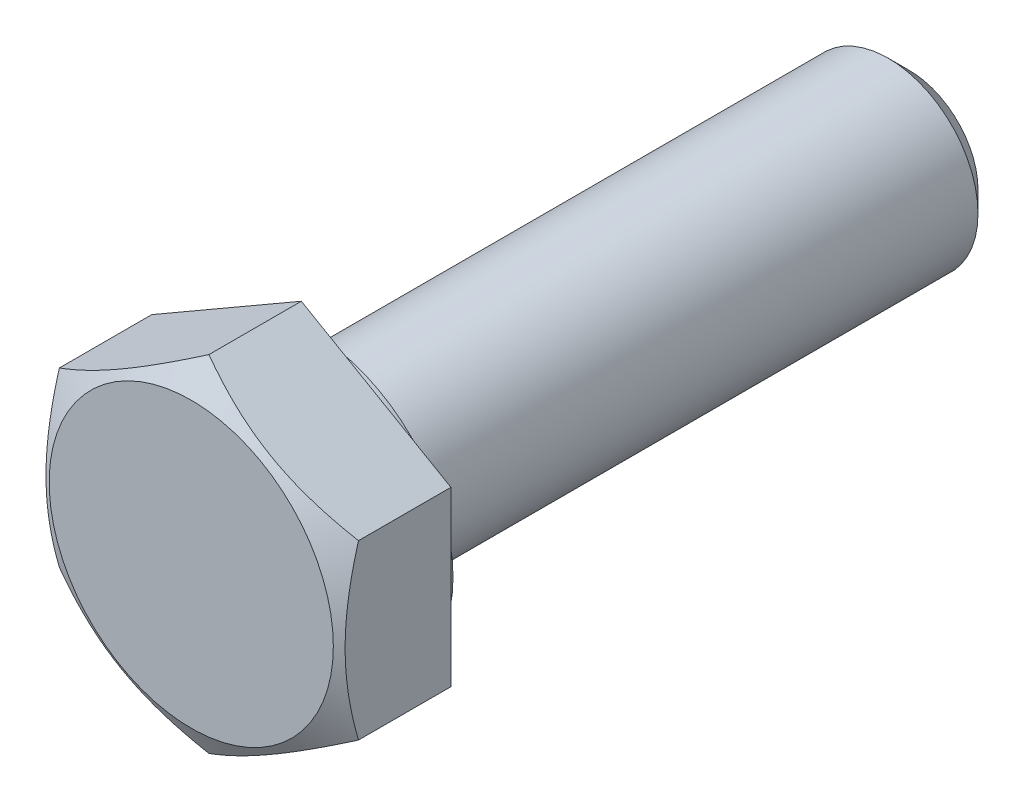
ISO-10303-21;
HEADER;
FILE_DESCRIPTION(('STEP AP214'),'2;1');
FILE_NAME('part.step','',(''),(''),'','','');
FILE_SCHEMA(('AUTOMOTIVE_DESIGN { 1 0 10303 214 1 1 1 1 }'));
ENDSEC;
DATA;
#1=APPLICATION_CONTEXT('core data for automotive mechanical design processes');
#2=APPLICATION_PROTOCOL_DEFINITION('international standard','automotive_design',2000,#1);
#3=PRODUCT_CONTEXT('',#1,'mechanical');
#4=PRODUCT('Part','Part','',(#3));
#5=PRODUCT_RELATED_PRODUCT_CATEGORY('part','',(#4));
#6=PRODUCT_DEFINITION_FORMATION('','',#4);
#7=PRODUCT_DEFINITION_CONTEXT('part definition',#1,'design');
#8=PRODUCT_DEFINITION('design','',#6,#7);
#9=PRODUCT_DEFINITION_SHAPE('','',#8);
#10=(LENGTH_UNIT() NAMED_UNIT(*) SI_UNIT(.MILLI.,.METRE.));
#11=(NAMED_UNIT(*) PLANE_ANGLE_UNIT() SI_UNIT($,.RADIAN.));
#12=(NAMED_UNIT(*) SI_UNIT($,.STERADIAN.) SOLID_ANGLE_UNIT());
#13=UNCERTAINTY_MEASURE_WITH_UNIT(LENGTH_MEASURE(1.E-05),#10,'distance_accuracy_value','');
#14=(GEOMETRIC_REPRESENTATION_CONTEXT(3) GLOBAL_UNCERTAINTY_ASSIGNED_CONTEXT((#13)) GLOBAL_UNIT_ASSIGNED_CONTEXT((#10,
#11,#12)) REPRESENTATION_CONTEXT('',''));
#15=CARTESIAN_POINT('',(0.,0.,0.));
#16=DIRECTION('',(0.,0.,1.));
#17=DIRECTION('',(1.,0.,0.));
#18=AXIS2_PLACEMENT_3D('',#15,#16,#17);
#19=CARTESIAN_POINT('',(0.,5.77350269189626,8.32));
#20=DIRECTION('',(0.,0.,1.));
#21=DIRECTION('',(1.,0.,0.));
#22=AXIS2_PLACEMENT_3D('',#19,#20,#21);
#23=PLANE('',#22);
#24=CARTESIAN_POINT('',(0.,0.,8.32));
#25=DIRECTION('',(0.,0.,1.));
#26=DIRECTION('',(1.,0.,0.));
#27=AXIS2_PLACEMENT_3D('',#24,#25,#26);
#28=CIRCLE('',#27,4.75);
#29=CARTESIAN_POINT('',(4.75,0.,8.32));
#30=VERTEX_POINT('',#29);
#31=EDGE_CURVE('E186',#30,#30,#28,.T.);
#32=ORIENTED_EDGE('',*,*,#31,.T.);
#33=EDGE_LOOP('',(#32));
#34=FACE_BOUND('',#33,.T.);
#35=DIRECTION('',(0.,1.,0.));
#36=VECTOR('',#35,1.);
#37=CARTESIAN_POINT('',(5.,5.77350269189626,8.32));
#38=LINE('',#37,#36);
#39=CARTESIAN_POINT('',(5.,-2.88675134594813,8.32));
#40=VERTEX_POINT('',#39);
#41=CARTESIAN_POINT('',(5.,2.88675134594813,8.32));
#42=VERTEX_POINT('',#41);
#43=EDGE_CURVE('E12',#40,#42,#38,.T.);
#44=ORIENTED_EDGE('',*,*,#43,.F.);
#45=DIRECTION('',(0.866025403784439,0.5,0.));
#46=VECTOR('',#45,1.);
#47=CARTESIAN_POINT('',(5.,-2.88675134594813,8.32));
#48=LINE('',#47,#46);
#49=CARTESIAN_POINT('',(0.,-5.77350269189626,8.32));
#50=VERTEX_POINT('',#49);
#51=EDGE_CURVE('E46',#50,#40,#48,.T.);
#52=ORIENTED_EDGE('',*,*,#51,.F.);
#53=DIRECTION('',(0.866025403784439,-0.5,0.));
#54=VECTOR('',#53,1.);
#55=CARTESIAN_POINT('',(-5.,-2.88675134594813,8.32));
#56=LINE('',#55,#54);
#57=CARTESIAN_POINT('',(-5.,-2.88675134594813,8.32));
#58=VERTEX_POINT('',#57);
#59=EDGE_CURVE('E108',#58,#50,#56,.T.);
#60=ORIENTED_EDGE('',*,*,#59,.F.);
#61=DIRECTION('',(0.,-1.,0.));
#62=VECTOR('',#61,1.);
#63=CARTESIAN_POINT('',(-5.,5.77350269189626,8.32));
#64=LINE('',#63,#62);
#65=CARTESIAN_POINT('',(-5.,2.88675134594813,8.32));
#66=VERTEX_POINT('',#65);
#67=EDGE_CURVE('E106',#66,#58,#64,.T.);
#68=ORIENTED_EDGE('',*,*,#67,.F.);
#69=DIRECTION('',(-0.866025403784439,-0.5,0.));
#70=VECTOR('',#69,1.);
#71=CARTESIAN_POINT('',(0.,5.77350269189626,8.32));
#72=LINE('',#71,#70);
#73=CARTESIAN_POINT('',(0.,5.77350269189626,8.32));
#74=VERTEX_POINT('',#73);
#75=EDGE_CURVE('E92',#74,#66,#72,.T.);
#76=ORIENTED_EDGE('',*,*,#75,.F.);
#77=DIRECTION('',(-0.866025403784439,0.5,0.));
#78=VECTOR('',#77,1.);
#79=CARTESIAN_POINT('',(0.,5.77350269189626,8.32));
#80=LINE('',#79,#78);
#81=EDGE_CURVE('E87',#42,#74,#80,.T.);
#82=ORIENTED_EDGE('',*,*,#81,.F.);
#83=EDGE_LOOP('',(#44,#52,#60,#68,#76,#82));
#84=FACE_BOUND('',#83,.T.);
#85=ADVANCED_FACE('F38',(#34,#84),#23,.F.);
#86=CARTESIAN_POINT('',(0.,0.,12.));
#87=DIRECTION('',(0.,0.,1.));
#88=DIRECTION('',(1.,0.,0.));
#89=AXIS2_PLACEMENT_3D('',#86,#87,#88);
#90=CYLINDRICAL_SURFACE('',#89,4.75);
#91=ORIENTED_EDGE('',*,*,#31,.F.);
#92=EDGE_LOOP('',(#91));
#93=FACE_BOUND('',#92,.T.);
#94=CARTESIAN_POINT('',(0.,0.,8.));
#95=DIRECTION('',(0.,0.,1.));
#96=DIRECTION('',(1.,0.,0.));
#97=AXIS2_PLACEMENT_3D('',#94,#95,#96);
#98=CIRCLE('',#97,4.75);
#99=CARTESIAN_POINT('',(4.75,0.,8.));
#100=VERTEX_POINT('',#99);
#101=EDGE_CURVE('E183',#100,#100,#98,.T.);
#102=ORIENTED_EDGE('',*,*,#101,.T.);
#103=EDGE_LOOP('',(#102));
#104=FACE_BOUND('',#103,.T.);
#105=ADVANCED_FACE('F221',(#93,#104),#90,.T.);
#106=CARTESIAN_POINT('',(0.,4.75,8.));
#107=DIRECTION('',(0.,0.,1.));
#108=DIRECTION('',(1.,0.,0.));
#109=AXIS2_PLACEMENT_3D('',#106,#107,#108);
#110=PLANE('',#109);
#111=ORIENTED_EDGE('',*,*,#101,.F.);
#112=EDGE_LOOP('',(#111));
#113=FACE_BOUND('',#112,.T.);
#114=CARTESIAN_POINT('',(0.,0.,8.));
#115=DIRECTION('',(0.,0.,1.));
#116=DIRECTION('',(1.,0.,0.));
#117=AXIS2_PLACEMENT_3D('',#114,#115,#116);
#118=CIRCLE('',#117,3.);
#119=CARTESIAN_POINT('',(3.,0.,8.));
#120=VERTEX_POINT('',#119);
#121=EDGE_CURVE('E180',#120,#120,#118,.T.);
#122=ORIENTED_EDGE('',*,*,#121,.T.);
#123=EDGE_LOOP('',(#122));
#124=FACE_BOUND('',#123,.T.);
#125=ADVANCED_FACE('F226',(#113,#124),#110,.F.);
#126=CARTESIAN_POINT('',(0.,0.,12.));
#127=DIRECTION('',(0.,0.,1.));
#128=DIRECTION('',(1.,0.,0.));
#129=AXIS2_PLACEMENT_3D('',#126,#127,#128);
#130=CYLINDRICAL_SURFACE('',#129,3.);
#131=ORIENTED_EDGE('',*,*,#121,.F.);
#132=EDGE_LOOP('',(#131));
#133=FACE_BOUND('',#132,.T.);
#134=CARTESIAN_POINT('',(0.,0.,-11.3));
#135=DIRECTION('',(0.,0.,1.));
#136=DIRECTION('',(1.,0.,0.));
#137=AXIS2_PLACEMENT_3D('',#134,#135,#136);
#138=CIRCLE('',#137,3.);
#139=CARTESIAN_POINT('',(3.,0.,-11.3));
#140=VERTEX_POINT('',#139);
#141=EDGE_CURVE('E177',#140,#140,#138,.T.);
#142=ORIENTED_EDGE('',*,*,#141,.T.);
#143=EDGE_LOOP('',(#142));
#144=FACE_BOUND('',#143,.T.);
#145=ADVANCED_FACE('F232',(#133,#144),#130,.T.);
#146=CARTESIAN_POINT('',(0.,0.,-12.));
#147=DIRECTION('',(0.,0.,1.));
#148=DIRECTION('',(1.,0.,0.));
#149=AXIS2_PLACEMENT_3D('',#146,#147,#148);
#150=CONICAL_SURFACE('',#149,2.29999999999999,0.78539816339745);
#151=ORIENTED_EDGE('',*,*,#141,.F.);
#152=EDGE_LOOP('',(#151));
#153=FACE_BOUND('',#152,.T.);
#154=CARTESIAN_POINT('',(0.,0.,-12.));
#155=DIRECTION('',(0.,0.,1.));
#156=DIRECTION('',(1.,0.,0.));
#157=AXIS2_PLACEMENT_3D('',#154,#155,#156);
#158=CIRCLE('',#157,2.29999999999999);
#159=CARTESIAN_POINT('',(2.29999999999999,0.,-12.));
#160=VERTEX_POINT('',#159);
#161=EDGE_CURVE('E167',#160,#160,#158,.T.);
#162=ORIENTED_EDGE('',*,*,#161,.T.);
#163=EDGE_LOOP('',(#162));
#164=FACE_BOUND('',#163,.T.);
#165=ADVANCED_FACE('F235',(#153,#164),#150,.T.);
#166=CARTESIAN_POINT('',(0.,2.29999999999999,-12.));
#167=DIRECTION('',(0.,0.,1.));
#168=DIRECTION('',(1.,0.,0.));
#169=AXIS2_PLACEMENT_3D('',#166,#167,#168);
#170=PLANE('',#169);
#171=ORIENTED_EDGE('',*,*,#161,.F.);
#172=EDGE_LOOP('',(#171));
#173=FACE_BOUND('',#172,.T.);
#174=ADVANCED_FACE('F158',(#173),#170,.F.);
#175=CARTESIAN_POINT('',(5.,-2.88675134594813,-12.));
#176=DIRECTION('',(1.,0.,0.));
#177=DIRECTION('',(0.,1.,0.));
#178=AXIS2_PLACEMENT_3D('',#175,#176,#177);
#179=PLANE('',#178);
#180=CARTESIAN_POINT('',(5.,-7.63608831020962,9.47269384044658));
#181=CARTESIAN_POINT('',(5.,-7.41671502063001,9.57862390183092));
#182=CARTESIAN_POINT('',(5.,-7.19682078948626,9.68349478183039));
#183=CARTESIAN_POINT('',(5.,-6.75570867749105,9.89051245252426));
#184=CARTESIAN_POINT('',(5.,-6.53449057337866,9.99265876692992));
#185=CARTESIAN_POINT('',(5.,-6.08924401850543,10.1941640760569));
#186=CARTESIAN_POINT('',(5.,-5.86520671689426,10.2935035850024));
#187=CARTESIAN_POINT('',(5.,-5.41528330479419,10.4878868135465));
#188=CARTESIAN_POINT('',(5.,-5.18939729207492,10.5829307586056));
#189=CARTESIAN_POINT('',(5.,-4.73270635601579,10.7686699506858));
#190=CARTESIAN_POINT('',(5.,-4.5018748681938,10.8593002418616));
#191=CARTESIAN_POINT('',(5.,-4.03748213336677,11.0334125903535));
#192=CARTESIAN_POINT('',(5.,-3.80392058531511,11.1168938507237));
#193=CARTESIAN_POINT('',(5.,-3.33418257692391,11.2744503927579));
#194=CARTESIAN_POINT('',(5.,-3.09801295329933,11.3485458479584));
#195=CARTESIAN_POINT('',(5.,-2.622317210366,11.4849114956443));
#196=CARTESIAN_POINT('',(5.,-2.38279218329777,11.5471854444038));
#197=CARTESIAN_POINT('',(5.,-1.90021405498409,11.6568740474413));
#198=CARTESIAN_POINT('',(5.,-1.65715979122221,11.7042836837094));
#199=CARTESIAN_POINT('',(5.,-1.16814339899781,11.7810345020717));
#200=CARTESIAN_POINT('',(5.,-0.922181264261045,11.8103756451725));
#201=CARTESIAN_POINT('',(5.,-0.430179275668583,11.8483933297189));
#202=CARTESIAN_POINT('',(5.,-0.18414962738837,11.8571985975323));
#203=CARTESIAN_POINT('',(5.,0.307704322292009,11.8536856005624));
#204=CARTESIAN_POINT('',(5.,0.553528660038113,11.8413727165713));
#205=CARTESIAN_POINT('',(5.,0.973839544225612,11.8031276828399));
#206=CARTESIAN_POINT('',(5.,1.14879180614304,11.7820465400916));
#207=CARTESIAN_POINT('',(5.,1.49733080573963,11.7305685605382));
#208=CARTESIAN_POINT('',(5.,1.67091733426056,11.700170324272));
#209=CARTESIAN_POINT('',(5.,2.18990458001968,11.5965135855341));
#210=CARTESIAN_POINT('',(5.,2.53285316893865,11.510862772391));
#211=CARTESIAN_POINT('',(5.,3.04581132525505,11.3633458062989));
#212=CARTESIAN_POINT('',(5.,3.21850342236316,11.3102849605877));
#213=CARTESIAN_POINT('',(5.,3.56221900439277,11.1989136733608));
#214=CARTESIAN_POINT('',(5.,3.73324233808919,11.1406027608866));
#215=CARTESIAN_POINT('',(5.,4.07276682817564,11.0199778737321));
#216=CARTESIAN_POINT('',(5.,4.24127677843429,10.9576884020102));
#217=CARTESIAN_POINT('',(5.,4.57686542207983,10.82952844901));
#218=CARTESIAN_POINT('',(5.,4.74394458950532,10.7636592114534));
#219=CARTESIAN_POINT('',(5.,4.91042173992309,10.6963357738042));
#220=B_SPLINE_CURVE_WITH_KNOTS('',3,(#180,#181,#182,#183,#184,#185,#186,#187,#188,#189,#190,
#191,#192,#193,#194,#195,#196,#197,#198,#199,#200,#201,#202,#203,#204,#205,#206,#207,#208,#209,
#210,#211,#212,#213,#214,#215,#216,#217,#218,#219),.UNSPECIFIED.,.F.,.F.,(4,2,2,2,2,2,2,2,2,2,2,
2,2,2,2,2,2,2,2,4),(0.,0.730839835481473,1.46180660468968,2.19699145656864,2.93213767603387,
3.67600400363847,4.4199531468705,5.16227511291297,5.90436081048045,6.64669675802213,
7.38903430757832,8.12670595994832,8.86418968544289,9.39258492676547,9.92105957388045,
10.9800497280791,11.5219872993396,12.0639735337611,12.602894729619,13.1416298698482),.UNSPECIFIED.);
#221=CARTESIAN_POINT('',(5.,2.88675134594813,11.4090804453174));
#222=VERTEX_POINT('',#221);
#223=CARTESIAN_POINT('',(5.,-2.88675134594813,11.4090804453174));
#224=VERTEX_POINT('',#223);
#225=EDGE_CURVE('E125',#222,#224,#220,.F.);
#226=ORIENTED_EDGE('',*,*,#225,.T.);
#227=DIRECTION('',(0.,0.,1.));
#228=VECTOR('',#227,1.);
#229=CARTESIAN_POINT('',(5.,-2.88675134594813,-12.));
#230=LINE('',#229,#228);
#231=EDGE_CURVE('E118',#40,#224,#230,.T.);
#232=ORIENTED_EDGE('',*,*,#231,.F.);
#233=ORIENTED_EDGE('',*,*,#43,.T.);
#234=DIRECTION('',(0.,0.,1.));
#235=VECTOR('',#234,1.);
#236=CARTESIAN_POINT('',(5.,2.88675134594813,-12.));
#237=LINE('',#236,#235);
#238=EDGE_CURVE('E58',#42,#222,#237,.T.);
#239=ORIENTED_EDGE('',*,*,#238,.T.);
#240=EDGE_LOOP('',(#226,#232,#233,#239));
#241=FACE_BOUND('',#240,.T.);
#242=ADVANCED_FACE('F123',(#241),#179,.T.);
#243=CARTESIAN_POINT('',(0.,-5.77350269189626,-12.));
#244=DIRECTION('',(0.5,-0.866025403784439,0.));
#245=DIRECTION('',(0.866025403784439,0.5,0.));
#246=AXIS2_PLACEMENT_3D('',#243,#244,#245);
#247=PLANE('',#246);
#248=CARTESIAN_POINT('',(5.0002,-2.88663587589429,11.4090137766508));
#249=CARTESIAN_POINT('',(4.78046540547481,-3.01349970319368,11.482275865065));
#250=CARTESIAN_POINT('',(4.55885141554042,-3.14144859993849,11.5489111107845));
#251=CARTESIAN_POINT('',(4.11178600454649,-3.39956193532121,11.6652234416918));
#252=CARTESIAN_POINT('',(3.88632664040923,-3.52973095989718,11.7148593827868));
#253=CARTESIAN_POINT('',(3.43816769477649,-3.78847564779798,11.7921114072839));
#254=CARTESIAN_POINT('',(3.21553790689581,-3.91701101576052,11.8202420544191));
#255=CARTESIAN_POINT('',(2.88081009815336,-4.11026620624323,11.8454675107489));
#256=CARTESIAN_POINT('',(2.76915780319494,-4.17472868879311,11.8510489729331));
#257=CARTESIAN_POINT('',(2.5457500293262,-4.30371322717528,11.8564602159511));
#258=CARTESIAN_POINT('',(2.43399455370969,-4.36823528110589,11.8562901744444));
#259=CARTESIAN_POINT('',(2.12781576914936,-4.54500768479194,11.8479088009106));
#260=CARTESIAN_POINT('',(1.93349391403279,-4.65719946015293,11.8338326608053));
#261=CARTESIAN_POINT('',(1.54613989800229,-4.88083840557981,11.7891971755932));
#262=CARTESIAN_POINT('',(1.35310909862843,-4.9922847895602,11.7586225725551));
#263=CARTESIAN_POINT('',(0.964974657525146,-5.21637431361295,11.6821939390814));
#264=CARTESIAN_POINT('',(0.769920001358265,-5.32898917185759,11.6360160538239));
#265=CARTESIAN_POINT('',(0.382719654641232,-5.55253939626498,11.5312106382107));
#266=CARTESIAN_POINT('',(0.190569004591913,-5.66347762579592,11.4726077292652));
#267=CARTESIAN_POINT('',(-0.000200000000000036,-5.7736181619501,11.4090137766508));
#268=B_SPLINE_CURVE_WITH_KNOTS('',3,(#248,#249,#250,#251,#252,#253,#254,#255,#256,#257,#258,
#259,#260,#261,#262,#263,#264,#265,#266,#267),.UNSPECIFIED.,.F.,.F.,(4,2,2,2,2,2,2,2,2,4),(0.,
0.792555841363089,1.58701660053333,2.3618153748728,2.74884076077325,3.13585419177295,
3.80962362599679,4.48401723901189,5.17336882348928,5.86136694793725),.UNSPECIFIED.);
#269=CARTESIAN_POINT('',(0.,-5.77350269189626,11.4090804453174));
#270=VERTEX_POINT('',#269);
#271=EDGE_CURVE('E168',#224,#270,#268,.T.);
#272=ORIENTED_EDGE('',*,*,#271,.T.);
#273=DIRECTION('',(0.,0.,1.));
#274=VECTOR('',#273,1.);
#275=CARTESIAN_POINT('',(0.,-5.77350269189626,-12.));
#276=LINE('',#275,#274);
#277=EDGE_CURVE('E121',#50,#270,#276,.T.);
#278=ORIENTED_EDGE('',*,*,#277,.F.);
#279=ORIENTED_EDGE('',*,*,#51,.T.);
#280=ORIENTED_EDGE('',*,*,#231,.T.);
#281=EDGE_LOOP('',(#272,#278,#279,#280));
#282=FACE_BOUND('',#281,.T.);
#283=ADVANCED_FACE('F117',(#282),#247,.T.);
#284=CARTESIAN_POINT('',(-5.,-2.88675134594813,-12.));
#285=DIRECTION('',(-0.5,-0.866025403784439,0.));
#286=DIRECTION('',(0.866025403784439,-0.5,0.));
#287=AXIS2_PLACEMENT_3D('',#284,#285,#286);
#288=PLANE('',#287);
#289=CARTESIAN_POINT('',(0.000199999999999797,-5.7736181619501,11.4090137766508));
#290=CARTESIAN_POINT('',(-0.219534594525185,-5.64675433465071,11.482275865065));
#291=CARTESIAN_POINT('',(-0.441148584459581,-5.5188054379059,11.5489111107845));
#292=CARTESIAN_POINT('',(-0.888213995453513,-5.26069210252318,11.6652234416918));
#293=CARTESIAN_POINT('',(-1.11367335959077,-5.13052307794721,11.7148593827868));
#294=CARTESIAN_POINT('',(-1.56183230522351,-4.87177839004641,11.7921114072839));
#295=CARTESIAN_POINT('',(-1.78446209310419,-4.74324302208387,11.8202420544191));
#296=CARTESIAN_POINT('',(-2.11918990184664,-4.54998783160116,11.8454675107489));
#297=CARTESIAN_POINT('',(-2.23084219680506,-4.48552534905128,11.8510489729331));
#298=CARTESIAN_POINT('',(-2.4542499706738,-4.35654081066911,11.8564602159511));
#299=CARTESIAN_POINT('',(-2.56600544629031,-4.2920187567385,11.8562901744444));
#300=CARTESIAN_POINT('',(-2.87218423085064,-4.11524635305244,11.8479088009106));
#301=CARTESIAN_POINT('',(-3.06650608596721,-4.00305457769146,11.8338326608053));
#302=CARTESIAN_POINT('',(-3.45386010199771,-3.77941563226458,11.7891971755932));
#303=CARTESIAN_POINT('',(-3.64689090137157,-3.66796924828419,11.7586225725551));
#304=CARTESIAN_POINT('',(-4.03502534247485,-3.44387972423144,11.6821939390814));
#305=CARTESIAN_POINT('',(-4.23007999864174,-3.3312648659868,11.6360160538239));
#306=CARTESIAN_POINT('',(-4.61728034535877,-3.10771464157941,11.5312106382107));
#307=CARTESIAN_POINT('',(-4.80943099540809,-2.99677641204847,11.4726077292652));
#308=CARTESIAN_POINT('',(-5.0002,-2.88663587589429,11.4090137766508));
#309=B_SPLINE_CURVE_WITH_KNOTS('',3,(#289,#290,#291,#292,#293,#294,#295,#296,#297,#298,#299,
#300,#301,#302,#303,#304,#305,#306,#307,#308),.UNSPECIFIED.,.F.,.F.,(4,2,2,2,2,2,2,2,2,4),(0.,
0.79255584136309,1.58701660053333,2.3618153748728,2.74884076077325,3.13585419177295,
3.80962362599679,4.48401723901189,5.17336882348928,5.86136694793725),.UNSPECIFIED.);
#310=CARTESIAN_POINT('',(-5.,-2.88675134594813,11.4090804453174));
#311=VERTEX_POINT('',#310);
#312=EDGE_CURVE('E196',#270,#311,#309,.T.);
#313=ORIENTED_EDGE('',*,*,#312,.T.);
#314=DIRECTION('',(0.,0.,1.));
#315=VECTOR('',#314,1.);
#316=CARTESIAN_POINT('',(-5.,-2.88675134594813,-12.));
#317=LINE('',#316,#315);
#318=EDGE_CURVE('E129',#58,#311,#317,.T.);
#319=ORIENTED_EDGE('',*,*,#318,.F.);
#320=ORIENTED_EDGE('',*,*,#59,.T.);
#321=ORIENTED_EDGE('',*,*,#277,.T.);
#322=EDGE_LOOP('',(#313,#319,#320,#321));
#323=FACE_BOUND('',#322,.T.);
#324=ADVANCED_FACE('F209',(#323),#288,.T.);
#325=CARTESIAN_POINT('',(-5.,2.88675134594813,-12.));
#326=DIRECTION('',(-1.,0.,0.));
#327=DIRECTION('',(0.,0.,1.));
#328=AXIS2_PLACEMENT_3D('',#325,#326,#327);
#329=PLANE('',#328);
#330=CARTESIAN_POINT('',(-5.,-7.63608831020962,9.47269384044658));
#331=CARTESIAN_POINT('',(-5.,-7.41671502063001,9.57862390183092));
#332=CARTESIAN_POINT('',(-5.,-7.19682078948626,9.68349478183039));
#333=CARTESIAN_POINT('',(-5.,-6.75570867749105,9.89051245252426));
#334=CARTESIAN_POINT('',(-5.,-6.53449057337866,9.99265876692992));
#335=CARTESIAN_POINT('',(-5.,-6.08924401850543,10.1941640760569));
#336=CARTESIAN_POINT('',(-5.,-5.86520671689427,10.2935035850024));
#337=CARTESIAN_POINT('',(-5.,-5.41528330479419,10.4878868135465));
#338=CARTESIAN_POINT('',(-5.,-5.18939729207492,10.5829307586056));
#339=CARTESIAN_POINT('',(-5.,-4.7327063560158,10.7686699506858));
#340=CARTESIAN_POINT('',(-5.,-4.5018748681938,10.8593002418616));
#341=CARTESIAN_POINT('',(-5.,-4.03748213336678,11.0334125903534));
#342=CARTESIAN_POINT('',(-5.,-3.80392058531511,11.1168938507237));
#343=CARTESIAN_POINT('',(-5.,-3.33418257692391,11.2744503927579));
#344=CARTESIAN_POINT('',(-5.,-3.09801295329933,11.3485458479584));
#345=CARTESIAN_POINT('',(-5.,-2.622317210366,11.4849114956443));
#346=CARTESIAN_POINT('',(-5.,-2.38279218329777,11.5471854444038));
#347=CARTESIAN_POINT('',(-5.,-1.90021405498409,11.6568740474413));
#348=CARTESIAN_POINT('',(-5.,-1.6571597912222,11.7042836837094));
#349=CARTESIAN_POINT('',(-5.,-1.16814339899781,11.7810345020717));
#350=CARTESIAN_POINT('',(-5.,-0.922181264261042,11.8103756451725));
#351=CARTESIAN_POINT('',(-5.,-0.430179275668582,11.8483933297189));
#352=CARTESIAN_POINT('',(-5.,-0.184149627388368,11.8571985975323));
#353=CARTESIAN_POINT('',(-5.,0.30770432229201,11.8536856005624));
#354=CARTESIAN_POINT('',(-5.,0.553528660038114,11.8413727165713));
#355=CARTESIAN_POINT('',(-5.,0.973839544225612,11.8031276828399));
#356=CARTESIAN_POINT('',(-5.,1.14879180614304,11.7820465400916));
#357=CARTESIAN_POINT('',(-5.,1.49733080573963,11.7305685605382));
#358=CARTESIAN_POINT('',(-5.,1.67091733426056,11.700170324272));
#359=CARTESIAN_POINT('',(-5.,2.18990458001968,11.5965135855341));
#360=CARTESIAN_POINT('',(-5.,2.53285316893865,11.510862772391));
#361=CARTESIAN_POINT('',(-5.,3.04581132525505,11.3633458062989));
#362=CARTESIAN_POINT('',(-5.,3.21850342236316,11.3102849605877));
#363=CARTESIAN_POINT('',(-5.,3.56221900439277,11.1989136733608));
#364=CARTESIAN_POINT('',(-5.,3.7332423380892,11.1406027608866));
#365=CARTESIAN_POINT('',(-5.,4.07276682817565,11.0199778737321));
#366=CARTESIAN_POINT('',(-5.,4.24127677843429,10.9576884020102));
#367=CARTESIAN_POINT('',(-5.,4.57686542207984,10.82952844901));
#368=CARTESIAN_POINT('',(-5.,4.74394458950532,10.7636592114534));
#369=CARTESIAN_POINT('',(-5.,4.91042173992309,10.6963357738042));
#370=B_SPLINE_CURVE_WITH_KNOTS('',3,(#330,#331,#332,#333,#334,#335,#336,#337,#338,#339,#340,
#341,#342,#343,#344,#345,#346,#347,#348,#349,#350,#351,#352,#353,#354,#355,#356,#357,#358,#359,
#360,#361,#362,#363,#364,#365,#366,#367,#368,#369),.UNSPECIFIED.,.F.,.F.,(4,2,2,2,2,2,2,2,2,2,2,
2,2,2,2,2,2,2,2,4),(0.,0.730839835481472,1.46180660468967,2.19699145656864,2.93213767603386,
3.67600400363847,4.4199531468705,5.16227511291297,5.90436081048045,6.64669675802214,
7.38903430757833,8.12670595994832,8.8641896854429,9.39258492676547,9.92105957388045,
10.9800497280791,11.5219872993396,12.0639735337611,12.602894729619,13.1416298698482),.UNSPECIFIED.);
#371=CARTESIAN_POINT('',(-5.,2.88675134594813,11.4090804453174));
#372=VERTEX_POINT('',#371);
#373=EDGE_CURVE('E197',#311,#372,#370,.T.);
#374=ORIENTED_EDGE('',*,*,#373,.T.);
#375=DIRECTION('',(0.,0.,1.));
#376=VECTOR('',#375,1.);
#377=CARTESIAN_POINT('',(-5.,2.88675134594813,-12.));
#378=LINE('',#377,#376);
#379=EDGE_CURVE('E102',#66,#372,#378,.T.);
#380=ORIENTED_EDGE('',*,*,#379,.F.);
#381=ORIENTED_EDGE('',*,*,#67,.T.);
#382=ORIENTED_EDGE('',*,*,#318,.T.);
#383=EDGE_LOOP('',(#374,#380,#381,#382));
#384=FACE_BOUND('',#383,.T.);
#385=ADVANCED_FACE('F212',(#384),#329,.T.);
#386=CARTESIAN_POINT('',(0.,5.77350269189626,-12.));
#387=DIRECTION('',(-0.5,0.866025403784439,0.));
#388=DIRECTION('',(-0.866025403784439,-0.5,0.));
#389=AXIS2_PLACEMENT_3D('',#386,#387,#388);
#390=PLANE('',#389);
#391=CARTESIAN_POINT('',(-5.0002,2.88663587589429,11.4090137766508));
#392=CARTESIAN_POINT('',(-4.78046540547481,3.01349970319368,11.482275865065));
#393=CARTESIAN_POINT('',(-4.55885141554042,3.14144859993849,11.5489111107845));
#394=CARTESIAN_POINT('',(-4.11178600454649,3.39956193532121,11.6652234416918));
#395=CARTESIAN_POINT('',(-3.88632664040923,3.52973095989718,11.7148593827868));
#396=CARTESIAN_POINT('',(-3.43816769477649,3.78847564779798,11.7921114072839));
#397=CARTESIAN_POINT('',(-3.21553790689581,3.91701101576052,11.8202420544191));
#398=CARTESIAN_POINT('',(-2.88081009815336,4.11026620624323,11.8454675107489));
#399=CARTESIAN_POINT('',(-2.76915780319494,4.17472868879311,11.8510489729331));
#400=CARTESIAN_POINT('',(-2.5457500293262,4.30371322717528,11.8564602159511));
#401=CARTESIAN_POINT('',(-2.43399455370969,4.36823528110589,11.8562901744444));
#402=CARTESIAN_POINT('',(-2.12781576914936,4.54500768479195,11.8479088009106));
#403=CARTESIAN_POINT('',(-1.93349391403279,4.65719946015293,11.8338326608053));
#404=CARTESIAN_POINT('',(-1.5461398980023,4.88083840557981,11.7891971755932));
#405=CARTESIAN_POINT('',(-1.35310909862843,4.9922847895602,11.7586225725551));
#406=CARTESIAN_POINT('',(-0.964974657525148,5.21637431361295,11.6821939390814));
#407=CARTESIAN_POINT('',(-0.769920001358267,5.32898917185759,11.6360160538239));
#408=CARTESIAN_POINT('',(-0.382719654641235,5.55253939626498,11.5312106382107));
#409=CARTESIAN_POINT('',(-0.190569004591917,5.66347762579592,11.4726077292652));
#410=CARTESIAN_POINT('',(0.000199999999996128,5.7736181619501,11.4090137766508));
#411=B_SPLINE_CURVE_WITH_KNOTS('',3,(#391,#392,#393,#394,#395,#396,#397,#398,#399,#400,#401,
#402,#403,#404,#405,#406,#407,#408,#409,#410),.UNSPECIFIED.,.F.,.F.,(4,2,2,2,2,2,2,2,2,4),(0.,
0.79255584136309,1.58701660053333,2.3618153748728,2.74884076077325,3.13585419177294,
3.80962362599679,4.48401723901189,5.17336882348928,5.86136694793724),.UNSPECIFIED.);
#412=CARTESIAN_POINT('',(0.,5.77350269189626,11.4090804453174));
#413=VERTEX_POINT('',#412);
#414=EDGE_CURVE('E100',#372,#413,#411,.T.);
#415=ORIENTED_EDGE('',*,*,#414,.T.);
#416=DIRECTION('',(0.,0.,1.));
#417=VECTOR('',#416,1.);
#418=CARTESIAN_POINT('',(0.,5.77350269189626,-12.));
#419=LINE('',#418,#417);
#420=EDGE_CURVE('E53',#74,#413,#419,.T.);
#421=ORIENTED_EDGE('',*,*,#420,.F.);
#422=ORIENTED_EDGE('',*,*,#75,.T.);
#423=ORIENTED_EDGE('',*,*,#379,.T.);
#424=EDGE_LOOP('',(#415,#421,#422,#423));
#425=FACE_BOUND('',#424,.T.);
#426=ADVANCED_FACE('F96',(#425),#390,.T.);
#427=CARTESIAN_POINT('',(5.,2.88675134594813,-12.));
#428=DIRECTION('',(0.5,0.866025403784439,0.));
#429=DIRECTION('',(-0.866025403784439,0.5,0.));
#430=AXIS2_PLACEMENT_3D('',#427,#428,#429);
#431=PLANE('',#430);
#432=CARTESIAN_POINT('',(-0.000200000000003495,5.7736181619501,11.4090137766508));
#433=CARTESIAN_POINT('',(0.219534594525181,5.64675433465071,11.482275865065));
#434=CARTESIAN_POINT('',(0.441148584459577,5.5188054379059,11.5489111107845));
#435=CARTESIAN_POINT('',(0.888213995453509,5.26069210252318,11.6652234416918));
#436=CARTESIAN_POINT('',(1.11367335959077,5.13052307794721,11.7148593827868));
#437=CARTESIAN_POINT('',(1.5618323052235,4.87177839004641,11.7921114072839));
#438=CARTESIAN_POINT('',(1.78446209310419,4.74324302208387,11.8202420544191));
#439=CARTESIAN_POINT('',(2.11918990184664,4.54998783160116,11.8454675107489));
#440=CARTESIAN_POINT('',(2.23084219680505,4.48552534905128,11.8510489729331));
#441=CARTESIAN_POINT('',(2.45424997067379,4.35654081066911,11.8564602159511));
#442=CARTESIAN_POINT('',(2.56600544629031,4.2920187567385,11.8562901744444));
#443=CARTESIAN_POINT('',(2.87218423085063,4.11524635305245,11.8479088009106));
#444=CARTESIAN_POINT('',(3.06650608596721,4.00305457769146,11.8338326608053));
#445=CARTESIAN_POINT('',(3.4538601019977,3.77941563226458,11.7891971755932));
#446=CARTESIAN_POINT('',(3.64689090137157,3.66796924828419,11.7586225725551));
#447=CARTESIAN_POINT('',(4.03502534247485,3.44387972423144,11.6821939390814));
#448=CARTESIAN_POINT('',(4.23007999864173,3.3312648659868,11.6360160538239));
#449=CARTESIAN_POINT('',(4.61728034535876,3.10771464157941,11.5312106382107));
#450=CARTESIAN_POINT('',(4.80943099540808,2.99677641204847,11.4726077292652));
#451=CARTESIAN_POINT('',(5.0002,2.88663587589429,11.4090137766508));
#452=B_SPLINE_CURVE_WITH_KNOTS('',3,(#432,#433,#434,#435,#436,#437,#438,#439,#440,#441,#442,
#443,#444,#445,#446,#447,#448,#449,#450,#451),.UNSPECIFIED.,.F.,.F.,(4,2,2,2,2,2,2,2,2,4),(0.,
0.792555841363089,1.58701660053333,2.3618153748728,2.74884076077325,3.13585419177294,
3.80962362599679,4.48401723901189,5.17336882348928,5.86136694793725),.UNSPECIFIED.);
#453=EDGE_CURVE('E126',#413,#222,#452,.T.);
#454=ORIENTED_EDGE('',*,*,#453,.T.);
#455=ORIENTED_EDGE('',*,*,#238,.F.);
#456=ORIENTED_EDGE('',*,*,#81,.T.);
#457=ORIENTED_EDGE('',*,*,#420,.T.);
#458=EDGE_LOOP('',(#454,#455,#456,#457));
#459=FACE_BOUND('',#458,.T.);
#460=ADVANCED_FACE('F88',(#459),#431,.T.);
#461=CARTESIAN_POINT('',(0.,0.,12.));
#462=DIRECTION('',(0.,0.,-1.));
#463=DIRECTION('',(-1.,0.,0.));
#464=AXIS2_PLACEMENT_3D('',#461,#462,#463);
#465=PLANE('',#464);
#466=CARTESIAN_POINT('',(0.,0.,12.));
#467=DIRECTION('',(0.,0.,1.));
#468=DIRECTION('',(1.,0.,0.));
#469=AXIS2_PLACEMENT_3D('',#466,#467,#468);
#470=CIRCLE('',#469,4.75);
#471=CARTESIAN_POINT('',(4.75,0.,12.));
#472=VERTEX_POINT('',#471);
#473=EDGE_CURVE('E93',#472,#472,#470,.T.);
#474=ORIENTED_EDGE('',*,*,#473,.T.);
#475=EDGE_LOOP('',(#474));
#476=FACE_BOUND('',#475,.T.);
#477=ADVANCED_FACE('F40',(#476),#465,.F.);
#478=CARTESIAN_POINT('',(0.,0.,11.4090804453174));
#479=DIRECTION('',(0.,0.,-1.));
#480=DIRECTION('',(-1.,0.,0.));
#481=AXIS2_PLACEMENT_3D('',#478,#479,#480);
#482=CONICAL_SURFACE('',#481,5.77350269189626,1.0471975511966);
#483=ORIENTED_EDGE('',*,*,#473,.F.);
#484=EDGE_LOOP('',(#483));
#485=FACE_BOUND('',#484,.T.);
#486=ORIENTED_EDGE('',*,*,#225,.F.);
#487=ORIENTED_EDGE('',*,*,#453,.F.);
#488=ORIENTED_EDGE('',*,*,#414,.F.);
#489=ORIENTED_EDGE('',*,*,#373,.F.);
#490=ORIENTED_EDGE('',*,*,#312,.F.);
#491=ORIENTED_EDGE('',*,*,#271,.F.);
#492=EDGE_LOOP('',(#486,#487,#488,#489,#490,#491));
#493=FACE_BOUND('',#492,.T.);
#494=ADVANCED_FACE('F147',(#485,#493),#482,.T.);
#495=CLOSED_SHELL('',(#85,#105,#125,#145,#165,#174,#242,#283,#324,#385,#426,#460,#477,#494));
#496=MANIFOLD_SOLID_BREP('B2',#495);
#497=ADVANCED_BREP_SHAPE_REPRESENTATION('',(#18,#496),#14);
#498=SHAPE_DEFINITION_REPRESENTATION(#9,#497);
ENDSEC;
END-ISO-10303-21;
